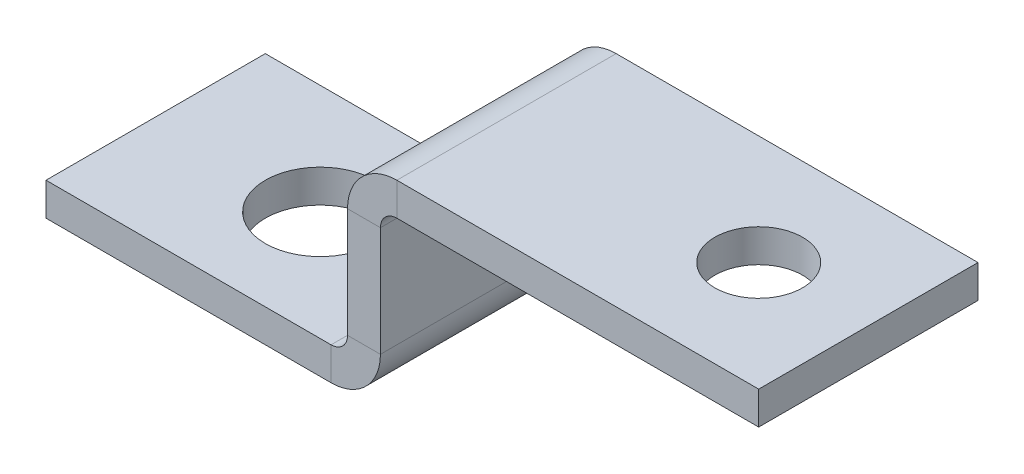
ISO-10303-21;
HEADER;
FILE_DESCRIPTION(('STEP AP214'),'2;1');
FILE_NAME('part.step','',(''),(''),'','','');
FILE_SCHEMA(('AUTOMOTIVE_DESIGN { 1 0 10303 214 1 1 1 1 }'));
ENDSEC;
DATA;
#1=APPLICATION_CONTEXT('core data for automotive mechanical design processes');
#2=APPLICATION_PROTOCOL_DEFINITION('international standard','automotive_design',2000,#1);
#3=PRODUCT_CONTEXT('',#1,'mechanical');
#4=PRODUCT('Part','Part','',(#3));
#5=PRODUCT_RELATED_PRODUCT_CATEGORY('part','',(#4));
#6=PRODUCT_DEFINITION_FORMATION('','',#4);
#7=PRODUCT_DEFINITION_CONTEXT('part definition',#1,'design');
#8=PRODUCT_DEFINITION('design','',#6,#7);
#9=PRODUCT_DEFINITION_SHAPE('','',#8);
#10=(LENGTH_UNIT() NAMED_UNIT(*) SI_UNIT(.MILLI.,.METRE.));
#11=(NAMED_UNIT(*) PLANE_ANGLE_UNIT() SI_UNIT($,.RADIAN.));
#12=(NAMED_UNIT(*) SI_UNIT($,.STERADIAN.) SOLID_ANGLE_UNIT());
#13=UNCERTAINTY_MEASURE_WITH_UNIT(LENGTH_MEASURE(1.E-05),#10,'distance_accuracy_value','');
#14=(GEOMETRIC_REPRESENTATION_CONTEXT(3) GLOBAL_UNCERTAINTY_ASSIGNED_CONTEXT((#13)) GLOBAL_UNIT_ASSIGNED_CONTEXT((#10,
#11,#12)) REPRESENTATION_CONTEXT('',''));
#15=CARTESIAN_POINT('',(0.,0.,0.));
#16=DIRECTION('',(0.,0.,1.));
#17=DIRECTION('',(1.,0.,0.));
#18=AXIS2_PLACEMENT_3D('',#15,#16,#17);
#19=CARTESIAN_POINT('',(13.75,0.75,10.));
#20=DIRECTION('',(0.,0.,1.));
#21=DIRECTION('',(1.,0.,0.));
#22=AXIS2_PLACEMENT_3D('',#19,#20,#21);
#23=PLANE('',#22);
#24=DIRECTION('',(1.,0.,0.));
#25=VECTOR('',#24,1.);
#26=CARTESIAN_POINT('',(13.75,0.75,10.));
#27=LINE('',#26,#25);
#28=CARTESIAN_POINT('',(13.75,0.75,10.));
#29=VERTEX_POINT('',#28);
#30=CARTESIAN_POINT('',(15.25,0.75,10.));
#31=VERTEX_POINT('',#30);
#32=EDGE_CURVE('E11',#29,#31,#27,.T.);
#33=ORIENTED_EDGE('',*,*,#32,.F.);
#34=CARTESIAN_POINT('',(13.,0.75,10.));
#35=DIRECTION('',(0.,0.,-1.));
#36=DIRECTION('',(-1.,0.,0.));
#37=AXIS2_PLACEMENT_3D('',#34,#35,#36);
#38=CIRCLE('',#37,0.75);
#39=CARTESIAN_POINT('',(13.,0.,10.));
#40=VERTEX_POINT('',#39);
#41=EDGE_CURVE('E287',#40,#29,#38,.F.);
#42=ORIENTED_EDGE('',*,*,#41,.F.);
#43=DIRECTION('',(0.,1.,0.));
#44=VECTOR('',#43,1.);
#45=CARTESIAN_POINT('',(13.,-1.5,10.));
#46=LINE('',#45,#44);
#47=CARTESIAN_POINT('',(13.,-1.5,10.));
#48=VERTEX_POINT('',#47);
#49=EDGE_CURVE('E50',#48,#40,#46,.T.);
#50=ORIENTED_EDGE('',*,*,#49,.F.);
#51=CARTESIAN_POINT('',(13.,0.75,10.));
#52=DIRECTION('',(0.,0.,1.));
#53=DIRECTION('',(1.,0.,0.));
#54=AXIS2_PLACEMENT_3D('',#51,#52,#53);
#55=CIRCLE('',#54,2.25);
#56=EDGE_CURVE('E151',#48,#31,#55,.T.);
#57=ORIENTED_EDGE('',*,*,#56,.T.);
#58=EDGE_LOOP('',(#33,#42,#50,#57));
#59=FACE_BOUND('',#58,.T.);
#60=ADVANCED_FACE('F41',(#59),#23,.T.);
#61=CARTESIAN_POINT('',(13.,-1.5,10.));
#62=DIRECTION('',(0.,0.,1.));
#63=DIRECTION('',(1.,0.,0.));
#64=AXIS2_PLACEMENT_3D('',#61,#62,#63);
#65=PLANE('',#64);
#66=DIRECTION('',(0.,1.,0.));
#67=VECTOR('',#66,1.);
#68=CARTESIAN_POINT('',(13.75,0.,10.));
#69=LINE('',#68,#67);
#70=CARTESIAN_POINT('',(13.75,5.75,10.));
#71=VERTEX_POINT('',#70);
#72=EDGE_CURVE('E145',#29,#71,#69,.T.);
#73=ORIENTED_EDGE('',*,*,#72,.F.);
#74=ORIENTED_EDGE('',*,*,#32,.T.);
#75=DIRECTION('',(0.,1.,0.));
#76=VECTOR('',#75,1.);
#77=CARTESIAN_POINT('',(15.25,0.,10.));
#78=LINE('',#77,#76);
#79=CARTESIAN_POINT('',(15.25,5.75,10.));
#80=VERTEX_POINT('',#79);
#81=EDGE_CURVE('E142',#31,#80,#78,.T.);
#82=ORIENTED_EDGE('',*,*,#81,.T.);
#83=DIRECTION('',(-1.,0.,0.));
#84=VECTOR('',#83,1.);
#85=CARTESIAN_POINT('',(15.25,5.75,10.));
#86=LINE('',#85,#84);
#87=EDGE_CURVE('E263',#80,#71,#86,.T.);
#88=ORIENTED_EDGE('',*,*,#87,.T.);
#89=EDGE_LOOP('',(#73,#74,#82,#88));
#90=FACE_BOUND('',#89,.T.);
#91=ADVANCED_FACE('F140',(#90),#65,.T.);
#92=CARTESIAN_POINT('',(13.,0.,0.));
#93=DIRECTION('',(0.,0.,-1.));
#94=DIRECTION('',(-1.,0.,0.));
#95=AXIS2_PLACEMENT_3D('',#92,#93,#94);
#96=PLANE('',#95);
#97=DIRECTION('',(0.,-1.,0.));
#98=VECTOR('',#97,1.);
#99=CARTESIAN_POINT('',(13.,0.,0.));
#100=LINE('',#99,#98);
#101=CARTESIAN_POINT('',(13.,0.,0.));
#102=VERTEX_POINT('',#101);
#103=CARTESIAN_POINT('',(13.,-1.5,0.));
#104=VERTEX_POINT('',#103);
#105=EDGE_CURVE('E271',#102,#104,#100,.T.);
#106=ORIENTED_EDGE('',*,*,#105,.F.);
#107=CARTESIAN_POINT('',(13.,0.75,0.));
#108=DIRECTION('',(0.,0.,-1.));
#109=DIRECTION('',(-1.,0.,0.));
#110=AXIS2_PLACEMENT_3D('',#107,#108,#109);
#111=CIRCLE('',#110,0.75);
#112=CARTESIAN_POINT('',(13.75,0.75,0.));
#113=VERTEX_POINT('',#112);
#114=EDGE_CURVE('E200',#102,#113,#111,.F.);
#115=ORIENTED_EDGE('',*,*,#114,.T.);
#116=DIRECTION('',(-1.,0.,0.));
#117=VECTOR('',#116,1.);
#118=CARTESIAN_POINT('',(15.25,0.75,0.));
#119=LINE('',#118,#117);
#120=CARTESIAN_POINT('',(15.25,0.75,0.));
#121=VERTEX_POINT('',#120);
#122=EDGE_CURVE('E268',#121,#113,#119,.T.);
#123=ORIENTED_EDGE('',*,*,#122,.F.);
#124=CARTESIAN_POINT('',(13.,0.75,0.));
#125=DIRECTION('',(0.,0.,1.));
#126=DIRECTION('',(1.,0.,0.));
#127=AXIS2_PLACEMENT_3D('',#124,#125,#126);
#128=CIRCLE('',#127,2.25);
#129=EDGE_CURVE('E164',#104,#121,#128,.T.);
#130=ORIENTED_EDGE('',*,*,#129,.F.);
#131=EDGE_LOOP('',(#106,#115,#123,#130));
#132=FACE_BOUND('',#131,.T.);
#133=ADVANCED_FACE('F355',(#132),#96,.T.);
#134=CARTESIAN_POINT('',(15.25,0.75,0.));
#135=DIRECTION('',(0.,0.,-1.));
#136=DIRECTION('',(-1.,0.,0.));
#137=AXIS2_PLACEMENT_3D('',#134,#135,#136);
#138=PLANE('',#137);
#139=DIRECTION('',(1.,0.,0.));
#140=VECTOR('',#139,1.);
#141=CARTESIAN_POINT('',(0.,0.,0.));
#142=LINE('',#141,#140);
#143=CARTESIAN_POINT('',(0.,0.,0.));
#144=VERTEX_POINT('',#143);
#145=EDGE_CURVE('E204',#144,#102,#142,.T.);
#146=ORIENTED_EDGE('',*,*,#145,.T.);
#147=ORIENTED_EDGE('',*,*,#105,.T.);
#148=DIRECTION('',(1.,0.,0.));
#149=VECTOR('',#148,1.);
#150=CARTESIAN_POINT('',(0.,-1.5,0.));
#151=LINE('',#150,#149);
#152=CARTESIAN_POINT('',(0.,-1.5,0.));
#153=VERTEX_POINT('',#152);
#154=EDGE_CURVE('E212',#153,#104,#151,.T.);
#155=ORIENTED_EDGE('',*,*,#154,.F.);
#156=DIRECTION('',(0.,1.,0.));
#157=VECTOR('',#156,1.);
#158=CARTESIAN_POINT('',(0.,-1.5,0.));
#159=LINE('',#158,#157);
#160=EDGE_CURVE('E208',#153,#144,#159,.T.);
#161=ORIENTED_EDGE('',*,*,#160,.T.);
#162=EDGE_LOOP('',(#146,#147,#155,#161));
#163=FACE_BOUND('',#162,.T.);
#164=ADVANCED_FACE('F358',(#163),#138,.T.);
#165=CARTESIAN_POINT('',(16.,8.,10.));
#166=DIRECTION('',(0.,0.,1.));
#167=DIRECTION('',(1.,0.,0.));
#168=AXIS2_PLACEMENT_3D('',#165,#166,#167);
#169=PLANE('',#168);
#170=DIRECTION('',(0.,-1.,0.));
#171=VECTOR('',#170,1.);
#172=CARTESIAN_POINT('',(16.,8.,10.));
#173=LINE('',#172,#171);
#174=CARTESIAN_POINT('',(16.,8.,10.));
#175=VERTEX_POINT('',#174);
#176=CARTESIAN_POINT('',(16.,6.5,10.));
#177=VERTEX_POINT('',#176);
#178=EDGE_CURVE('E58',#175,#177,#173,.T.);
#179=ORIENTED_EDGE('',*,*,#178,.F.);
#180=CARTESIAN_POINT('',(16.,5.75,10.));
#181=DIRECTION('',(0.,0.,1.));
#182=DIRECTION('',(1.,0.,0.));
#183=AXIS2_PLACEMENT_3D('',#180,#181,#182);
#184=CIRCLE('',#183,2.25);
#185=EDGE_CURVE('E302',#71,#175,#184,.F.);
#186=ORIENTED_EDGE('',*,*,#185,.F.);
#187=ORIENTED_EDGE('',*,*,#87,.F.);
#188=CARTESIAN_POINT('',(16.,5.75,10.));
#189=DIRECTION('',(0.,0.,1.));
#190=DIRECTION('',(1.,0.,0.));
#191=AXIS2_PLACEMENT_3D('',#188,#189,#190);
#192=CIRCLE('',#191,0.75);
#193=EDGE_CURVE('E174',#80,#177,#192,.F.);
#194=ORIENTED_EDGE('',*,*,#193,.T.);
#195=EDGE_LOOP('',(#179,#186,#187,#194));
#196=FACE_BOUND('',#195,.T.);
#197=ADVANCED_FACE('F385',(#196),#169,.T.);
#198=CARTESIAN_POINT('',(15.25,5.75,10.));
#199=DIRECTION('',(0.,0.,1.));
#200=DIRECTION('',(1.,0.,0.));
#201=AXIS2_PLACEMENT_3D('',#198,#199,#200);
#202=PLANE('',#201);
#203=DIRECTION('',(1.,0.,0.));
#204=VECTOR('',#203,1.);
#205=CARTESIAN_POINT('',(13.75,8.,10.));
#206=LINE('',#205,#204);
#207=CARTESIAN_POINT('',(32.5,8.,10.));
#208=VERTEX_POINT('',#207);
#209=EDGE_CURVE('E306',#175,#208,#206,.T.);
#210=ORIENTED_EDGE('',*,*,#209,.F.);
#211=ORIENTED_EDGE('',*,*,#178,.T.);
#212=DIRECTION('',(1.,0.,0.));
#213=VECTOR('',#212,1.);
#214=CARTESIAN_POINT('',(13.75,6.5,10.));
#215=LINE('',#214,#213);
#216=CARTESIAN_POINT('',(32.5,6.5,10.));
#217=VERTEX_POINT('',#216);
#218=EDGE_CURVE('E112',#177,#217,#215,.T.);
#219=ORIENTED_EDGE('',*,*,#218,.T.);
#220=DIRECTION('',(0.,-1.,0.));
#221=VECTOR('',#220,1.);
#222=CARTESIAN_POINT('',(32.5,8.,10.));
#223=LINE('',#222,#221);
#224=EDGE_CURVE('E310',#208,#217,#223,.T.);
#225=ORIENTED_EDGE('',*,*,#224,.F.);
#226=EDGE_LOOP('',(#210,#211,#219,#225));
#227=FACE_BOUND('',#226,.T.);
#228=ADVANCED_FACE('F388',(#227),#202,.T.);
#229=CARTESIAN_POINT('',(13.75,5.75,0.));
#230=DIRECTION('',(0.,0.,-1.));
#231=DIRECTION('',(-1.,0.,0.));
#232=AXIS2_PLACEMENT_3D('',#229,#230,#231);
#233=PLANE('',#232);
#234=DIRECTION('',(1.,0.,0.));
#235=VECTOR('',#234,1.);
#236=CARTESIAN_POINT('',(13.75,5.75,0.));
#237=LINE('',#236,#235);
#238=CARTESIAN_POINT('',(13.75,5.75,0.));
#239=VERTEX_POINT('',#238);
#240=CARTESIAN_POINT('',(15.25,5.75,0.));
#241=VERTEX_POINT('',#240);
#242=EDGE_CURVE('E99',#239,#241,#237,.T.);
#243=ORIENTED_EDGE('',*,*,#242,.F.);
#244=CARTESIAN_POINT('',(16.,5.75,0.));
#245=DIRECTION('',(0.,0.,1.));
#246=DIRECTION('',(1.,0.,0.));
#247=AXIS2_PLACEMENT_3D('',#244,#245,#246);
#248=CIRCLE('',#247,2.25);
#249=CARTESIAN_POINT('',(16.,8.,0.));
#250=VERTEX_POINT('',#249);
#251=EDGE_CURVE('E194',#239,#250,#248,.F.);
#252=ORIENTED_EDGE('',*,*,#251,.T.);
#253=DIRECTION('',(0.,1.,0.));
#254=VECTOR('',#253,1.);
#255=CARTESIAN_POINT('',(16.,6.5,0.));
#256=LINE('',#255,#254);
#257=CARTESIAN_POINT('',(16.,6.5,0.));
#258=VERTEX_POINT('',#257);
#259=EDGE_CURVE('E106',#258,#250,#256,.T.);
#260=ORIENTED_EDGE('',*,*,#259,.F.);
#261=CARTESIAN_POINT('',(16.,5.75,0.));
#262=DIRECTION('',(0.,0.,1.));
#263=DIRECTION('',(1.,0.,0.));
#264=AXIS2_PLACEMENT_3D('',#261,#262,#263);
#265=CIRCLE('',#264,0.75);
#266=EDGE_CURVE('E221',#241,#258,#265,.F.);
#267=ORIENTED_EDGE('',*,*,#266,.F.);
#268=EDGE_LOOP('',(#243,#252,#260,#267));
#269=FACE_BOUND('',#268,.T.);
#270=ADVANCED_FACE('F346',(#269),#233,.T.);
#271=CARTESIAN_POINT('',(16.,6.5,0.));
#272=DIRECTION('',(0.,0.,-1.));
#273=DIRECTION('',(-1.,0.,0.));
#274=AXIS2_PLACEMENT_3D('',#271,#272,#273);
#275=PLANE('',#274);
#276=DIRECTION('',(0.,1.,0.));
#277=VECTOR('',#276,1.);
#278=CARTESIAN_POINT('',(13.75,0.,0.));
#279=LINE('',#278,#277);
#280=EDGE_CURVE('E197',#113,#239,#279,.T.);
#281=ORIENTED_EDGE('',*,*,#280,.T.);
#282=ORIENTED_EDGE('',*,*,#242,.T.);
#283=DIRECTION('',(0.,1.,0.));
#284=VECTOR('',#283,1.);
#285=CARTESIAN_POINT('',(15.25,0.,0.));
#286=LINE('',#285,#284);
#287=EDGE_CURVE('E218',#121,#241,#286,.T.);
#288=ORIENTED_EDGE('',*,*,#287,.F.);
#289=ORIENTED_EDGE('',*,*,#122,.T.);
#290=EDGE_LOOP('',(#281,#282,#288,#289));
#291=FACE_BOUND('',#290,.T.);
#292=ADVANCED_FACE('F351',(#291),#275,.T.);
#293=CARTESIAN_POINT('',(13.75,6.5,10.));
#294=DIRECTION('',(0.,1.,0.));
#295=DIRECTION('',(0.,0.,1.));
#296=AXIS2_PLACEMENT_3D('',#293,#294,#295);
#297=PLANE('',#296);
#298=CARTESIAN_POINT('',(27.5,6.5,5.));
#299=DIRECTION('',(0.,1.,0.));
#300=DIRECTION('',(0.,0.,1.));
#301=AXIS2_PLACEMENT_3D('',#298,#299,#300);
#302=CIRCLE('',#301,2.);
#303=CARTESIAN_POINT('',(27.5,6.5,7.));
#304=VERTEX_POINT('',#303);
#305=EDGE_CURVE('E320',#304,#304,#302,.T.);
#306=ORIENTED_EDGE('',*,*,#305,.T.);
#307=EDGE_LOOP('',(#306));
#308=FACE_BOUND('',#307,.T.);
#309=DIRECTION('',(1.,0.,0.));
#310=VECTOR('',#309,1.);
#311=CARTESIAN_POINT('',(13.75,6.5,0.));
#312=LINE('',#311,#310);
#313=CARTESIAN_POINT('',(32.5,6.5,0.));
#314=VERTEX_POINT('',#313);
#315=EDGE_CURVE('E181',#258,#314,#312,.T.);
#316=ORIENTED_EDGE('',*,*,#315,.T.);
#317=DIRECTION('',(0.,0.,-1.));
#318=VECTOR('',#317,1.);
#319=CARTESIAN_POINT('',(32.5,6.5,10.));
#320=LINE('',#319,#318);
#321=EDGE_CURVE('E256',#217,#314,#320,.T.);
#322=ORIENTED_EDGE('',*,*,#321,.F.);
#323=ORIENTED_EDGE('',*,*,#218,.F.);
#324=DIRECTION('',(0.,0.,-1.));
#325=VECTOR('',#324,1.);
#326=CARTESIAN_POINT('',(16.,6.5,10.));
#327=LINE('',#326,#325);
#328=EDGE_CURVE('E177',#177,#258,#327,.T.);
#329=ORIENTED_EDGE('',*,*,#328,.T.);
#330=EDGE_LOOP('',(#316,#322,#323,#329));
#331=FACE_BOUND('',#330,.T.);
#332=ADVANCED_FACE('F396',(#308,#331),#297,.F.);
#333=CARTESIAN_POINT('',(32.5,8.,10.));
#334=DIRECTION('',(1.,0.,0.));
#335=DIRECTION('',(0.,0.,-1.));
#336=AXIS2_PLACEMENT_3D('',#333,#334,#335);
#337=PLANE('',#336);
#338=DIRECTION('',(0.,-1.,0.));
#339=VECTOR('',#338,1.);
#340=CARTESIAN_POINT('',(32.5,8.,0.));
#341=LINE('',#340,#339);
#342=CARTESIAN_POINT('',(32.5,8.,0.));
#343=VERTEX_POINT('',#342);
#344=EDGE_CURVE('E185',#343,#314,#341,.T.);
#345=ORIENTED_EDGE('',*,*,#344,.F.);
#346=DIRECTION('',(0.,0.,-1.));
#347=VECTOR('',#346,1.);
#348=CARTESIAN_POINT('',(32.5,8.,10.));
#349=LINE('',#348,#347);
#350=EDGE_CURVE('E253',#208,#343,#349,.T.);
#351=ORIENTED_EDGE('',*,*,#350,.F.);
#352=ORIENTED_EDGE('',*,*,#224,.T.);
#353=ORIENTED_EDGE('',*,*,#321,.T.);
#354=EDGE_LOOP('',(#345,#351,#352,#353));
#355=FACE_BOUND('',#354,.T.);
#356=ADVANCED_FACE('F339',(#355),#337,.T.);
#357=CARTESIAN_POINT('',(13.75,8.,10.));
#358=DIRECTION('',(0.,1.,0.));
#359=DIRECTION('',(0.,0.,1.));
#360=AXIS2_PLACEMENT_3D('',#357,#358,#359);
#361=PLANE('',#360);
#362=CARTESIAN_POINT('',(27.5,8.,5.));
#363=DIRECTION('',(0.,1.,0.));
#364=DIRECTION('',(0.,0.,1.));
#365=AXIS2_PLACEMENT_3D('',#362,#363,#364);
#366=CIRCLE('',#365,2.);
#367=CARTESIAN_POINT('',(27.5,8.,7.));
#368=VERTEX_POINT('',#367);
#369=EDGE_CURVE('E327',#368,#368,#366,.T.);
#370=ORIENTED_EDGE('',*,*,#369,.F.);
#371=EDGE_LOOP('',(#370));
#372=FACE_BOUND('',#371,.T.);
#373=DIRECTION('',(1.,0.,0.));
#374=VECTOR('',#373,1.);
#375=CARTESIAN_POINT('',(13.75,8.,0.));
#376=LINE('',#375,#374);
#377=EDGE_CURVE('E190',#250,#343,#376,.T.);
#378=ORIENTED_EDGE('',*,*,#377,.F.);
#379=DIRECTION('',(0.,0.,-1.));
#380=VECTOR('',#379,1.);
#381=CARTESIAN_POINT('',(16.,8.,10.));
#382=LINE('',#381,#380);
#383=EDGE_CURVE('E249',#175,#250,#382,.T.);
#384=ORIENTED_EDGE('',*,*,#383,.F.);
#385=ORIENTED_EDGE('',*,*,#209,.T.);
#386=ORIENTED_EDGE('',*,*,#350,.T.);
#387=EDGE_LOOP('',(#378,#384,#385,#386));
#388=FACE_BOUND('',#387,.T.);
#389=ADVANCED_FACE('F335',(#372,#388),#361,.T.);
#390=CARTESIAN_POINT('',(16.,5.75,10.));
#391=DIRECTION('',(0.,0.,-1.));
#392=DIRECTION('',(-1.,0.,0.));
#393=AXIS2_PLACEMENT_3D('',#390,#391,#392);
#394=CYLINDRICAL_SURFACE('',#393,2.25);
#395=ORIENTED_EDGE('',*,*,#251,.F.);
#396=DIRECTION('',(0.,0.,-1.));
#397=VECTOR('',#396,1.);
#398=CARTESIAN_POINT('',(13.75,5.75,10.));
#399=LINE('',#398,#397);
#400=EDGE_CURVE('E245',#71,#239,#399,.T.);
#401=ORIENTED_EDGE('',*,*,#400,.F.);
#402=ORIENTED_EDGE('',*,*,#185,.T.);
#403=ORIENTED_EDGE('',*,*,#383,.T.);
#404=EDGE_LOOP('',(#395,#401,#402,#403));
#405=FACE_BOUND('',#404,.T.);
#406=ADVANCED_FACE('F338',(#405),#394,.T.);
#407=CARTESIAN_POINT('',(13.75,0.,10.));
#408=DIRECTION('',(-1.,0.,0.));
#409=DIRECTION('',(0.,0.,1.));
#410=AXIS2_PLACEMENT_3D('',#407,#408,#409);
#411=PLANE('',#410);
#412=ORIENTED_EDGE('',*,*,#280,.F.);
#413=DIRECTION('',(0.,0.,-1.));
#414=VECTOR('',#413,1.);
#415=CARTESIAN_POINT('',(13.75,0.75,10.));
#416=LINE('',#415,#414);
#417=EDGE_CURVE('E241',#29,#113,#416,.T.);
#418=ORIENTED_EDGE('',*,*,#417,.F.);
#419=ORIENTED_EDGE('',*,*,#72,.T.);
#420=ORIENTED_EDGE('',*,*,#400,.T.);
#421=EDGE_LOOP('',(#412,#418,#419,#420));
#422=FACE_BOUND('',#421,.T.);
#423=ADVANCED_FACE('F353',(#422),#411,.T.);
#424=CARTESIAN_POINT('',(13.,0.75,10.));
#425=DIRECTION('',(0.,0.,-1.));
#426=DIRECTION('',(-1.,0.,0.));
#427=AXIS2_PLACEMENT_3D('',#424,#425,#426);
#428=CYLINDRICAL_SURFACE('',#427,0.75);
#429=ORIENTED_EDGE('',*,*,#114,.F.);
#430=DIRECTION('',(0.,0.,-1.));
#431=VECTOR('',#430,1.);
#432=CARTESIAN_POINT('',(13.,0.,10.));
#433=LINE('',#432,#431);
#434=EDGE_CURVE('E237',#40,#102,#433,.T.);
#435=ORIENTED_EDGE('',*,*,#434,.F.);
#436=ORIENTED_EDGE('',*,*,#41,.T.);
#437=ORIENTED_EDGE('',*,*,#417,.T.);
#438=EDGE_LOOP('',(#429,#435,#436,#437));
#439=FACE_BOUND('',#438,.T.);
#440=ADVANCED_FACE('F286',(#439),#428,.F.);
#441=CARTESIAN_POINT('',(0.,0.,10.));
#442=DIRECTION('',(0.,1.,0.));
#443=DIRECTION('',(0.,0.,1.));
#444=AXIS2_PLACEMENT_3D('',#441,#442,#443);
#445=PLANE('',#444);
#446=CARTESIAN_POINT('',(7.5,0.,5.));
#447=DIRECTION('',(0.,1.,0.));
#448=DIRECTION('',(0.,0.,1.));
#449=AXIS2_PLACEMENT_3D('',#446,#447,#448);
#450=CIRCLE('',#449,2.5);
#451=CARTESIAN_POINT('',(7.5,0.,7.5));
#452=VERTEX_POINT('',#451);
#453=EDGE_CURVE('E316',#452,#452,#450,.T.);
#454=ORIENTED_EDGE('',*,*,#453,.F.);
#455=EDGE_LOOP('',(#454));
#456=FACE_BOUND('',#455,.T.);
#457=ORIENTED_EDGE('',*,*,#145,.F.);
#458=DIRECTION('',(0.,0.,-1.));
#459=VECTOR('',#458,1.);
#460=CARTESIAN_POINT('',(0.,0.,10.));
#461=LINE('',#460,#459);
#462=CARTESIAN_POINT('',(0.,0.,10.));
#463=VERTEX_POINT('',#462);
#464=EDGE_CURVE('E234',#463,#144,#461,.T.);
#465=ORIENTED_EDGE('',*,*,#464,.F.);
#466=DIRECTION('',(1.,0.,0.));
#467=VECTOR('',#466,1.);
#468=CARTESIAN_POINT('',(0.,0.,10.));
#469=LINE('',#468,#467);
#470=EDGE_CURVE('E280',#463,#40,#469,.T.);
#471=ORIENTED_EDGE('',*,*,#470,.T.);
#472=ORIENTED_EDGE('',*,*,#434,.T.);
#473=EDGE_LOOP('',(#457,#465,#471,#472));
#474=FACE_BOUND('',#473,.T.);
#475=ADVANCED_FACE('F292',(#456,#474),#445,.T.);
#476=CARTESIAN_POINT('',(0.,-1.5,10.));
#477=DIRECTION('',(-1.,0.,0.));
#478=DIRECTION('',(0.,0.,1.));
#479=AXIS2_PLACEMENT_3D('',#476,#477,#478);
#480=PLANE('',#479);
#481=ORIENTED_EDGE('',*,*,#160,.F.);
#482=DIRECTION('',(0.,0.,-1.));
#483=VECTOR('',#482,1.);
#484=CARTESIAN_POINT('',(0.,-1.5,10.));
#485=LINE('',#484,#483);
#486=CARTESIAN_POINT('',(0.,-1.5,10.));
#487=VERTEX_POINT('',#486);
#488=EDGE_CURVE('E231',#487,#153,#485,.T.);
#489=ORIENTED_EDGE('',*,*,#488,.F.);
#490=DIRECTION('',(0.,1.,0.));
#491=VECTOR('',#490,1.);
#492=CARTESIAN_POINT('',(0.,-1.5,10.));
#493=LINE('',#492,#491);
#494=EDGE_CURVE('E294',#487,#463,#493,.T.);
#495=ORIENTED_EDGE('',*,*,#494,.T.);
#496=ORIENTED_EDGE('',*,*,#464,.T.);
#497=EDGE_LOOP('',(#481,#489,#495,#496));
#498=FACE_BOUND('',#497,.T.);
#499=ADVANCED_FACE('F363',(#498),#480,.T.);
#500=CARTESIAN_POINT('',(0.,-1.5,10.));
#501=DIRECTION('',(0.,1.,0.));
#502=DIRECTION('',(0.,0.,1.));
#503=AXIS2_PLACEMENT_3D('',#500,#501,#502);
#504=PLANE('',#503);
#505=CARTESIAN_POINT('',(7.5,-1.5,5.));
#506=DIRECTION('',(0.,1.,0.));
#507=DIRECTION('',(0.,0.,1.));
#508=AXIS2_PLACEMENT_3D('',#505,#506,#507);
#509=CIRCLE('',#508,2.5);
#510=CARTESIAN_POINT('',(7.5,-1.5,7.5));
#511=VERTEX_POINT('',#510);
#512=EDGE_CURVE('E186',#511,#511,#509,.T.);
#513=ORIENTED_EDGE('',*,*,#512,.T.);
#514=EDGE_LOOP('',(#513));
#515=FACE_BOUND('',#514,.T.);
#516=ORIENTED_EDGE('',*,*,#154,.T.);
#517=DIRECTION('',(0.,0.,-1.));
#518=VECTOR('',#517,1.);
#519=CARTESIAN_POINT('',(13.,-1.5,10.));
#520=LINE('',#519,#518);
#521=EDGE_CURVE('E167',#48,#104,#520,.T.);
#522=ORIENTED_EDGE('',*,*,#521,.F.);
#523=DIRECTION('',(1.,0.,0.));
#524=VECTOR('',#523,1.);
#525=CARTESIAN_POINT('',(0.,-1.5,10.));
#526=LINE('',#525,#524);
#527=EDGE_CURVE('E157',#487,#48,#526,.T.);
#528=ORIENTED_EDGE('',*,*,#527,.F.);
#529=ORIENTED_EDGE('',*,*,#488,.T.);
#530=EDGE_LOOP('',(#516,#522,#528,#529));
#531=FACE_BOUND('',#530,.T.);
#532=ADVANCED_FACE('F361',(#515,#531),#504,.F.);
#533=CARTESIAN_POINT('',(13.,0.75,10.));
#534=DIRECTION('',(0.,0.,-1.));
#535=DIRECTION('',(-1.,0.,0.));
#536=AXIS2_PLACEMENT_3D('',#533,#534,#535);
#537=CYLINDRICAL_SURFACE('',#536,2.25);
#538=ORIENTED_EDGE('',*,*,#129,.T.);
#539=DIRECTION('',(0.,0.,-1.));
#540=VECTOR('',#539,1.);
#541=CARTESIAN_POINT('',(15.25,0.75,10.));
#542=LINE('',#541,#540);
#543=EDGE_CURVE('E161',#31,#121,#542,.T.);
#544=ORIENTED_EDGE('',*,*,#543,.F.);
#545=ORIENTED_EDGE('',*,*,#56,.F.);
#546=ORIENTED_EDGE('',*,*,#521,.T.);
#547=EDGE_LOOP('',(#538,#544,#545,#546));
#548=FACE_BOUND('',#547,.T.);
#549=ADVANCED_FACE('F162',(#548),#537,.T.);
#550=CARTESIAN_POINT('',(15.25,0.,10.));
#551=DIRECTION('',(-1.,0.,0.));
#552=DIRECTION('',(0.,0.,1.));
#553=AXIS2_PLACEMENT_3D('',#550,#551,#552);
#554=PLANE('',#553);
#555=ORIENTED_EDGE('',*,*,#287,.T.);
#556=DIRECTION('',(0.,0.,-1.));
#557=VECTOR('',#556,1.);
#558=CARTESIAN_POINT('',(15.25,5.75,10.));
#559=LINE('',#558,#557);
#560=EDGE_CURVE('E168',#80,#241,#559,.T.);
#561=ORIENTED_EDGE('',*,*,#560,.F.);
#562=ORIENTED_EDGE('',*,*,#81,.F.);
#563=ORIENTED_EDGE('',*,*,#543,.T.);
#564=EDGE_LOOP('',(#555,#561,#562,#563));
#565=FACE_BOUND('',#564,.T.);
#566=ADVANCED_FACE('F170',(#565),#554,.F.);
#567=CARTESIAN_POINT('',(16.,5.75,10.));
#568=DIRECTION('',(0.,0.,-1.));
#569=DIRECTION('',(-1.,0.,0.));
#570=AXIS2_PLACEMENT_3D('',#567,#568,#569);
#571=CYLINDRICAL_SURFACE('',#570,0.75);
#572=ORIENTED_EDGE('',*,*,#266,.T.);
#573=ORIENTED_EDGE('',*,*,#328,.F.);
#574=ORIENTED_EDGE('',*,*,#193,.F.);
#575=ORIENTED_EDGE('',*,*,#560,.T.);
#576=EDGE_LOOP('',(#572,#573,#574,#575));
#577=FACE_BOUND('',#576,.T.);
#578=ADVANCED_FACE('F475',(#577),#571,.F.);
#579=CARTESIAN_POINT('',(16.,5.75,10.));
#580=DIRECTION('',(0.,0.,1.));
#581=DIRECTION('',(1.,0.,0.));
#582=AXIS2_PLACEMENT_3D('',#579,#580,#581);
#583=PLANE('',#582);
#584=ORIENTED_EDGE('',*,*,#527,.T.);
#585=ORIENTED_EDGE('',*,*,#49,.T.);
#586=ORIENTED_EDGE('',*,*,#470,.F.);
#587=ORIENTED_EDGE('',*,*,#494,.F.);
#588=EDGE_LOOP('',(#584,#585,#586,#587));
#589=FACE_BOUND('',#588,.T.);
#590=ADVANCED_FACE('F277',(#589),#583,.T.);
#591=CARTESIAN_POINT('',(16.,5.75,0.));
#592=DIRECTION('',(0.,0.,1.));
#593=DIRECTION('',(1.,0.,0.));
#594=AXIS2_PLACEMENT_3D('',#591,#592,#593);
#595=PLANE('',#594);
#596=ORIENTED_EDGE('',*,*,#315,.F.);
#597=ORIENTED_EDGE('',*,*,#259,.T.);
#598=ORIENTED_EDGE('',*,*,#377,.T.);
#599=ORIENTED_EDGE('',*,*,#344,.T.);
#600=EDGE_LOOP('',(#596,#597,#598,#599));
#601=FACE_BOUND('',#600,.T.);
#602=ADVANCED_FACE('F424',(#601),#595,.F.);
#603=CARTESIAN_POINT('',(7.5,-1.5,5.));
#604=DIRECTION('',(0.,1.,0.));
#605=DIRECTION('',(0.,0.,1.));
#606=AXIS2_PLACEMENT_3D('',#603,#604,#605);
#607=CYLINDRICAL_SURFACE('',#606,2.5);
#608=CARTESIAN_POINT('',(7.5,-1.5,7.5));
#609=CARTESIAN_POINT('',(7.5,-1.484375,7.5));
#610=CARTESIAN_POINT('',(7.5,-1.46875,7.5));
#611=CARTESIAN_POINT('',(7.5,-1.4375,7.5));
#612=CARTESIAN_POINT('',(7.5,-1.421875,7.5));
#613=CARTESIAN_POINT('',(7.5,-1.390625,7.5));
#614=CARTESIAN_POINT('',(7.5,-1.375,7.5));
#615=CARTESIAN_POINT('',(7.5,-1.34375,7.5));
#616=CARTESIAN_POINT('',(7.5,-1.328125,7.5));
#617=CARTESIAN_POINT('',(7.5,-1.296875,7.5));
#618=CARTESIAN_POINT('',(7.5,-1.28125,7.5));
#619=CARTESIAN_POINT('',(7.5,-1.25,7.5));
#620=CARTESIAN_POINT('',(7.5,-1.234375,7.5));
#621=CARTESIAN_POINT('',(7.5,-1.203125,7.5));
#622=CARTESIAN_POINT('',(7.5,-1.1875,7.5));
#623=CARTESIAN_POINT('',(7.5,-1.15625,7.5));
#624=CARTESIAN_POINT('',(7.5,-1.140625,7.5));
#625=CARTESIAN_POINT('',(7.5,-1.109375,7.5));
#626=CARTESIAN_POINT('',(7.5,-1.09375,7.5));
#627=CARTESIAN_POINT('',(7.5,-1.0625,7.5));
#628=CARTESIAN_POINT('',(7.5,-1.046875,7.5));
#629=CARTESIAN_POINT('',(7.5,-1.015625,7.5));
#630=CARTESIAN_POINT('',(7.5,-1.,7.5));
#631=CARTESIAN_POINT('',(7.5,-0.96875,7.5));
#632=CARTESIAN_POINT('',(7.5,-0.953125,7.5));
#633=CARTESIAN_POINT('',(7.5,-0.921875,7.5));
#634=CARTESIAN_POINT('',(7.5,-0.90625,7.5));
#635=CARTESIAN_POINT('',(7.5,-0.875,7.5));
#636=CARTESIAN_POINT('',(7.5,-0.859375,7.5));
#637=CARTESIAN_POINT('',(7.5,-0.828125,7.5));
#638=CARTESIAN_POINT('',(7.5,-0.8125,7.5));
#639=CARTESIAN_POINT('',(7.5,-0.78125,7.5));
#640=CARTESIAN_POINT('',(7.5,-0.765625,7.5));
#641=CARTESIAN_POINT('',(7.5,-0.734375,7.5));
#642=CARTESIAN_POINT('',(7.5,-0.71875,7.5));
#643=CARTESIAN_POINT('',(7.5,-0.6875,7.5));
#644=CARTESIAN_POINT('',(7.5,-0.671875,7.5));
#645=CARTESIAN_POINT('',(7.5,-0.640625,7.5));
#646=CARTESIAN_POINT('',(7.5,-0.625,7.5));
#647=CARTESIAN_POINT('',(7.5,-0.59375,7.5));
#648=CARTESIAN_POINT('',(7.5,-0.578125,7.5));
#649=CARTESIAN_POINT('',(7.5,-0.546875,7.5));
#650=CARTESIAN_POINT('',(7.5,-0.53125,7.5));
#651=CARTESIAN_POINT('',(7.5,-0.5,7.5));
#652=CARTESIAN_POINT('',(7.5,-0.484375,7.5));
#653=CARTESIAN_POINT('',(7.5,-0.453125,7.5));
#654=CARTESIAN_POINT('',(7.5,-0.4375,7.5));
#655=CARTESIAN_POINT('',(7.5,-0.40625,7.5));
#656=CARTESIAN_POINT('',(7.5,-0.390625,7.5));
#657=CARTESIAN_POINT('',(7.5,-0.359375,7.5));
#658=CARTESIAN_POINT('',(7.5,-0.34375,7.5));
#659=CARTESIAN_POINT('',(7.5,-0.3125,7.5));
#660=CARTESIAN_POINT('',(7.5,-0.296875,7.5));
#661=CARTESIAN_POINT('',(7.5,-0.265625,7.5));
#662=CARTESIAN_POINT('',(7.5,-0.25,7.5));
#663=CARTESIAN_POINT('',(7.5,-0.21875,7.5));
#664=CARTESIAN_POINT('',(7.5,-0.203125,7.5));
#665=CARTESIAN_POINT('',(7.5,-0.171875,7.5));
#666=CARTESIAN_POINT('',(7.5,-0.15625,7.5));
#667=CARTESIAN_POINT('',(7.5,-0.125,7.5));
#668=CARTESIAN_POINT('',(7.5,-0.109375,7.5));
#669=CARTESIAN_POINT('',(7.5,-0.0781250000000001,7.5));
#670=CARTESIAN_POINT('',(7.5,-0.0625000000000001,7.5));
#671=CARTESIAN_POINT('',(7.5,-0.03125,7.5));
#672=CARTESIAN_POINT('',(7.5,-0.015625,7.5));
#673=CARTESIAN_POINT('',(7.5,0.,7.5));
#674=B_SPLINE_CURVE_WITH_KNOTS('',3,(#608,#609,#610,#611,#612,#613,#614,#615,#616,#617,#618,
#619,#620,#621,#622,#623,#624,#625,#626,#627,#628,#629,#630,#631,#632,#633,#634,#635,#636,#637,
#638,#639,#640,#641,#642,#643,#644,#645,#646,#647,#648,#649,#650,#651,#652,#653,#654,#655,#656,
#657,#658,#659,#660,#661,#662,#663,#664,#665,#666,#667,#668,#669,#670,#671,#672,#673),
.UNSPECIFIED.,.F.,.F.,(4,2,2,2,2,2,2,2,2,2,2,2,2,2,2,2,2,2,2,2,2,2,2,2,2,2,2,2,2,2,2,2,4),(0.,
0.0468749999999998,0.0937499999999999,0.140625,0.1875,0.234375,0.28125,0.328125,0.375,0.421875,
0.46875,0.515625,0.5625,0.609375,0.65625,0.703125,0.75,0.796875,0.84375,0.890625,0.9375,
0.984375,1.03125,1.078125,1.125,1.171875,1.21875,1.265625,1.3125,1.359375,1.40625,1.453125,1.5),.UNSPECIFIED.);
#675=EDGE_CURVE('BSEAM438',#511,#452,#674,.T.);
#676=ORIENTED_EDGE('',*,*,#512,.F.);
#677=ORIENTED_EDGE('',*,*,#453,.T.);
#678=ORIENTED_EDGE('',*,*,#675,.T.);
#679=ORIENTED_EDGE('',*,*,#675,.F.);
#680=EDGE_LOOP('',(#676,#678,#677,#679));
#681=FACE_BOUND('',#680,.T.);
#682=ADVANCED_FACE('F438',(#681),#607,.F.);
#683=CARTESIAN_POINT('',(27.5,-1.5,5.));
#684=DIRECTION('',(0.,1.,0.));
#685=DIRECTION('',(0.,0.,1.));
#686=AXIS2_PLACEMENT_3D('',#683,#684,#685);
#687=CYLINDRICAL_SURFACE('',#686,2.);
#688=ORIENTED_EDGE('',*,*,#369,.T.);
#689=EDGE_LOOP('',(#688));
#690=FACE_BOUND('',#689,.T.);
#691=ORIENTED_EDGE('',*,*,#305,.F.);
#692=EDGE_LOOP('',(#691));
#693=FACE_BOUND('',#692,.T.);
#694=ADVANCED_FACE('F332',(#690,#693),#687,.F.);
#695=CLOSED_SHELL('',(#60,#91,#133,#164,#197,#228,#270,#292,#332,#356,#389,#406,#423,#440,#475,
#499,#532,#549,#566,#578,#590,#602,#682,#694));
#696=MANIFOLD_SOLID_BREP('B2',#695);
#697=ADVANCED_BREP_SHAPE_REPRESENTATION('',(#18,#696),#14);
#698=SHAPE_DEFINITION_REPRESENTATION(#9,#697);
ENDSEC;
END-ISO-10303-21;
